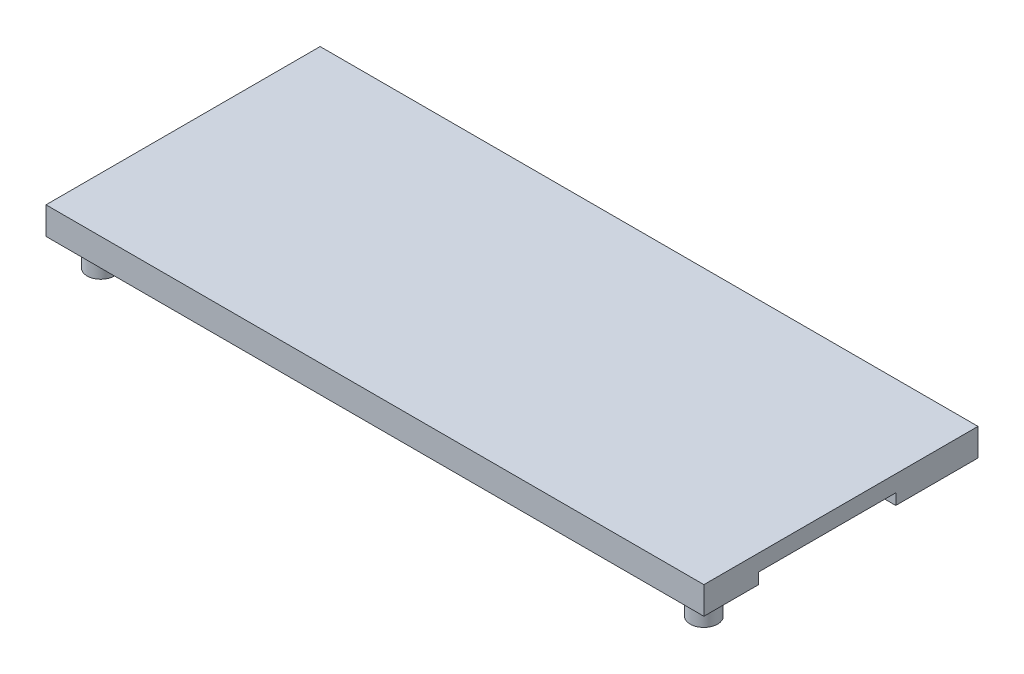
ISO-10303-21;
HEADER;
FILE_DESCRIPTION(('STEP AP214'),'2;1');
FILE_NAME('part.step','',(''),(''),'','','');
FILE_SCHEMA(('AUTOMOTIVE_DESIGN { 1 0 10303 214 1 1 1 1 }'));
ENDSEC;
DATA;
#1=APPLICATION_CONTEXT('core data for automotive mechanical design processes');
#2=APPLICATION_PROTOCOL_DEFINITION('international standard','automotive_design',2000,#1);
#3=PRODUCT_CONTEXT('',#1,'mechanical');
#4=PRODUCT('Part','Part','',(#3));
#5=PRODUCT_RELATED_PRODUCT_CATEGORY('part','',(#4));
#6=PRODUCT_DEFINITION_FORMATION('','',#4);
#7=PRODUCT_DEFINITION_CONTEXT('part definition',#1,'design');
#8=PRODUCT_DEFINITION('design','',#6,#7);
#9=PRODUCT_DEFINITION_SHAPE('','',#8);
#10=(LENGTH_UNIT() NAMED_UNIT(*) SI_UNIT(.MILLI.,.METRE.));
#11=(NAMED_UNIT(*) PLANE_ANGLE_UNIT() SI_UNIT($,.RADIAN.));
#12=(NAMED_UNIT(*) SI_UNIT($,.STERADIAN.) SOLID_ANGLE_UNIT());
#13=UNCERTAINTY_MEASURE_WITH_UNIT(LENGTH_MEASURE(1.E-05),#10,'distance_accuracy_value','');
#14=(GEOMETRIC_REPRESENTATION_CONTEXT(3) GLOBAL_UNCERTAINTY_ASSIGNED_CONTEXT((#13)) GLOBAL_UNIT_ASSIGNED_CONTEXT((#10,
#11,#12)) REPRESENTATION_CONTEXT('',''));
#15=CARTESIAN_POINT('',(0.,0.,0.));
#16=DIRECTION('',(0.,0.,1.));
#17=DIRECTION('',(1.,0.,0.));
#18=AXIS2_PLACEMENT_3D('',#15,#16,#17);
#19=CARTESIAN_POINT('',(380.766489354136,2.,-10.));
#20=DIRECTION('',(0.,0.,-1.));
#21=DIRECTION('',(-1.,0.,0.));
#22=AXIS2_PLACEMENT_3D('',#19,#20,#21);
#23=PLANE('',#22);
#24=DIRECTION('',(-0.850059990206795,-0.526685877017434,0.));
#25=VECTOR('',#24,1.);
#26=CARTESIAN_POINT('',(-46.1699249422818,2.,-10.));
#27=LINE('',#26,#25);
#28=CARTESIAN_POINT('',(-47.1379251019079,1.40023996082718,-10.));
#29=VERTEX_POINT('',#28);
#30=CARTESIAN_POINT('',(-49.3978831135569,0.,-10.));
#31=VERTEX_POINT('',#30);
#32=EDGE_CURVE('E211',#29,#31,#27,.T.);
#33=ORIENTED_EDGE('',*,*,#32,.F.);
#34=CARTESIAN_POINT('',(-45.0311815938382,-2.,-10.));
#35=DIRECTION('',(0.,0.,-1.));
#36=DIRECTION('',(-1.,0.,0.));
#37=AXIS2_PLACEMENT_3D('',#34,#35,#36);
#38=CIRCLE('',#37,4.);
#39=CARTESIAN_POINT('',(-45.0311815938382,2.,-10.));
#40=VERTEX_POINT('',#39);
#41=EDGE_CURVE('E425',#29,#40,#38,.T.);
#42=ORIENTED_EDGE('',*,*,#41,.T.);
#43=DIRECTION('',(-1.,0.,0.));
#44=VECTOR('',#43,1.);
#45=CARTESIAN_POINT('',(380.766489354136,2.,-10.));
#46=LINE('',#45,#44);
#47=CARTESIAN_POINT('',(-27.8534913925267,2.,-10.));
#48=VERTEX_POINT('',#47);
#49=EDGE_CURVE('E373',#48,#40,#46,.T.);
#50=ORIENTED_EDGE('',*,*,#49,.F.);
#51=DIRECTION('',(-0.00193419559193812,0.999998129441957,0.));
#52=VECTOR('',#51,1.);
#53=CARTESIAN_POINT('',(-27.8496229941068,0.,-10.));
#54=LINE('',#53,#52);
#55=CARTESIAN_POINT('',(-27.8496229941068,0.,-10.));
#56=VERTEX_POINT('',#55);
#57=EDGE_CURVE('E228',#56,#48,#54,.T.);
#58=ORIENTED_EDGE('',*,*,#57,.F.);
#59=DIRECTION('',(-1.,0.,0.));
#60=VECTOR('',#59,1.);
#61=CARTESIAN_POINT('',(380.766489354136,0.,-10.));
#62=LINE('',#61,#60);
#63=EDGE_CURVE('E226',#56,#31,#62,.T.);
#64=ORIENTED_EDGE('',*,*,#63,.T.);
#65=EDGE_LOOP('',(#33,#42,#50,#58,#64));
#66=FACE_BOUND('',#65,.T.);
#67=ADVANCED_FACE('F43',(#66),#23,.T.);
#68=CARTESIAN_POINT('',(380.766489354136,2.,-10.));
#69=DIRECTION('',(0.,-1.,0.));
#70=DIRECTION('',(0.,0.,-1.));
#71=AXIS2_PLACEMENT_3D('',#68,#69,#70);
#72=PLANE('',#71);
#73=ORIENTED_EDGE('',*,*,#49,.T.);
#74=DIRECTION('',(0.,0.,1.));
#75=VECTOR('',#74,1.);
#76=CARTESIAN_POINT('',(-45.0311815938382,2.,-10.));
#77=LINE('',#76,#75);
#78=CARTESIAN_POINT('',(-45.0311815938382,2.,-35.));
#79=VERTEX_POINT('',#78);
#80=EDGE_CURVE('E444',#40,#79,#77,.F.);
#81=ORIENTED_EDGE('',*,*,#80,.T.);
#82=DIRECTION('',(-1.,0.,0.));
#83=VECTOR('',#82,1.);
#84=CARTESIAN_POINT('',(380.766489354136,2.,-35.));
#85=LINE('',#84,#83);
#86=CARTESIAN_POINT('',(68.1463414634146,2.,-35.));
#87=VERTEX_POINT('',#86);
#88=EDGE_CURVE('E234',#87,#79,#85,.T.);
#89=ORIENTED_EDGE('',*,*,#88,.F.);
#90=DIRECTION('',(0.,0.,-1.));
#91=VECTOR('',#90,1.);
#92=CARTESIAN_POINT('',(68.1463414634146,2.,-10.));
#93=LINE('',#92,#91);
#94=CARTESIAN_POINT('',(68.1463414634146,2.,-10.));
#95=VERTEX_POINT('',#94);
#96=EDGE_CURVE('E360',#95,#87,#93,.T.);
#97=ORIENTED_EDGE('',*,*,#96,.F.);
#98=CARTESIAN_POINT('',(47.8052701751968,2.,-10.));
#99=VERTEX_POINT('',#98);
#100=EDGE_CURVE('E375',#95,#99,#46,.T.);
#101=ORIENTED_EDGE('',*,*,#100,.T.);
#102=DIRECTION('',(0.,0.,1.));
#103=VECTOR('',#102,1.);
#104=CARTESIAN_POINT('',(47.8052701751968,2.,-10.));
#105=LINE('',#104,#103);
#106=CARTESIAN_POINT('',(47.8052701751968,2.,-10.75));
#107=VERTEX_POINT('',#106);
#108=EDGE_CURVE('E440',#99,#107,#105,.F.);
#109=ORIENTED_EDGE('',*,*,#108,.T.);
#110=DIRECTION('',(1.,0.,0.));
#111=VECTOR('',#110,1.);
#112=CARTESIAN_POINT('',(46.1484159257044,2.,-10.75));
#113=LINE('',#112,#111);
#114=CARTESIAN_POINT('',(44.1484159257043,2.,-10.75));
#115=VERTEX_POINT('',#114);
#116=EDGE_CURVE('E338',#115,#107,#113,.T.);
#117=ORIENTED_EDGE('',*,*,#116,.F.);
#118=DIRECTION('',(0.,0.,1.));
#119=VECTOR('',#118,1.);
#120=CARTESIAN_POINT('',(44.1484159257044,2.,-10.75));
#121=LINE('',#120,#119);
#122=CARTESIAN_POINT('',(44.1484159257043,2.,-10.));
#123=VERTEX_POINT('',#122);
#124=EDGE_CURVE('E354',#115,#123,#121,.T.);
#125=ORIENTED_EDGE('',*,*,#124,.T.);
#126=CARTESIAN_POINT('',(23.8351869080494,2.,-10.));
#127=VERTEX_POINT('',#126);
#128=EDGE_CURVE('E380',#123,#127,#46,.T.);
#129=ORIENTED_EDGE('',*,*,#128,.T.);
#130=DIRECTION('',(0.,0.,1.));
#131=VECTOR('',#130,1.);
#132=CARTESIAN_POINT('',(23.8351869080494,2.,-10.));
#133=LINE('',#132,#131);
#134=CARTESIAN_POINT('',(23.8351869080494,2.,-13.8));
#135=VERTEX_POINT('',#134);
#136=EDGE_CURVE('E436',#127,#135,#133,.F.);
#137=ORIENTED_EDGE('',*,*,#136,.T.);
#138=DIRECTION('',(1.,0.,0.));
#139=VECTOR('',#138,1.);
#140=CARTESIAN_POINT('',(20.178332658557,2.,-13.8));
#141=LINE('',#140,#139);
#142=CARTESIAN_POINT('',(20.178332658557,2.,-13.8));
#143=VERTEX_POINT('',#142);
#144=EDGE_CURVE('E318',#143,#135,#141,.T.);
#145=ORIENTED_EDGE('',*,*,#144,.F.);
#146=DIRECTION('',(0.,0.,1.));
#147=VECTOR('',#146,1.);
#148=CARTESIAN_POINT('',(20.178332658557,2.,-13.8));
#149=LINE('',#148,#147);
#150=CARTESIAN_POINT('',(20.178332658557,2.,-10.));
#151=VERTEX_POINT('',#150);
#152=EDGE_CURVE('E321',#143,#151,#149,.T.);
#153=ORIENTED_EDGE('',*,*,#152,.T.);
#154=CARTESIAN_POINT('',(-0.196469998975601,2.,-10.));
#155=VERTEX_POINT('',#154);
#156=EDGE_CURVE('E500',#151,#155,#46,.T.);
#157=ORIENTED_EDGE('',*,*,#156,.T.);
#158=DIRECTION('',(0.,0.,1.));
#159=VECTOR('',#158,1.);
#160=CARTESIAN_POINT('',(-0.196469998975601,2.,-10.));
#161=LINE('',#160,#159);
#162=CARTESIAN_POINT('',(-0.196469998975591,2.,-15.95));
#163=VERTEX_POINT('',#162);
#164=EDGE_CURVE('E432',#155,#163,#161,.F.);
#165=ORIENTED_EDGE('',*,*,#164,.T.);
#166=DIRECTION('',(1.,0.,0.));
#167=VECTOR('',#166,1.);
#168=CARTESIAN_POINT('',(-3.85332424846797,2.,-15.95));
#169=LINE('',#168,#167);
#170=CARTESIAN_POINT('',(-3.85332424846802,2.,-15.95));
#171=VERTEX_POINT('',#170);
#172=EDGE_CURVE('E294',#171,#163,#169,.T.);
#173=ORIENTED_EDGE('',*,*,#172,.F.);
#174=DIRECTION('',(0.,0.,1.));
#175=VECTOR('',#174,1.);
#176=CARTESIAN_POINT('',(-3.85332424846797,2.,-15.95));
#177=LINE('',#176,#175);
#178=CARTESIAN_POINT('',(-3.85332424846802,2.,-10.));
#179=VERTEX_POINT('',#178);
#180=EDGE_CURVE('E297',#171,#179,#177,.T.);
#181=ORIENTED_EDGE('',*,*,#180,.T.);
#182=CARTESIAN_POINT('',(-24.1943684397684,2.,-10.));
#183=VERTEX_POINT('',#182);
#184=EDGE_CURVE('E507',#179,#183,#46,.T.);
#185=ORIENTED_EDGE('',*,*,#184,.T.);
#186=DIRECTION('',(0.,0.,1.));
#187=VECTOR('',#186,1.);
#188=CARTESIAN_POINT('',(-24.1943684397684,2.,-10.));
#189=LINE('',#188,#187);
#190=CARTESIAN_POINT('',(-24.1943684397684,2.,-17.1));
#191=VERTEX_POINT('',#190);
#192=EDGE_CURVE('E428',#183,#191,#189,.F.);
#193=ORIENTED_EDGE('',*,*,#192,.T.);
#194=DIRECTION('',(1.,0.,0.));
#195=VECTOR('',#194,1.);
#196=CARTESIAN_POINT('',(-27.8534913925267,2.,-17.1));
#197=LINE('',#196,#195);
#198=CARTESIAN_POINT('',(-27.8534913925267,2.,-17.1));
#199=VERTEX_POINT('',#198);
#200=EDGE_CURVE('E270',#199,#191,#197,.T.);
#201=ORIENTED_EDGE('',*,*,#200,.F.);
#202=DIRECTION('',(0.,0.,1.));
#203=VECTOR('',#202,1.);
#204=CARTESIAN_POINT('',(-27.8534913925267,2.,-17.1));
#205=LINE('',#204,#203);
#206=EDGE_CURVE('E273',#199,#48,#205,.T.);
#207=ORIENTED_EDGE('',*,*,#206,.T.);
#208=EDGE_LOOP('',(#73,#81,#89,#97,#101,#109,#117,#125,#129,#137,#145,#153,#157,#165,#173,#181,
#185,#193,#201,#207));
#209=FACE_BOUND('',#208,.T.);
#210=ADVANCED_FACE('F504',(#209),#72,.T.);
#211=CARTESIAN_POINT('',(380.766489354136,2.,-35.));
#212=DIRECTION('',(0.,0.,1.));
#213=DIRECTION('',(1.,0.,0.));
#214=AXIS2_PLACEMENT_3D('',#211,#212,#213);
#215=PLANE('',#214);
#216=ORIENTED_EDGE('',*,*,#88,.T.);
#217=CARTESIAN_POINT('',(-45.0311815938382,-2.,-35.));
#218=DIRECTION('',(0.,0.,1.));
#219=DIRECTION('',(1.,0.,0.));
#220=AXIS2_PLACEMENT_3D('',#217,#218,#219);
#221=CIRCLE('',#220,4.);
#222=CARTESIAN_POINT('',(-47.1379251019079,1.40023996082718,-35.));
#223=VERTEX_POINT('',#222);
#224=EDGE_CURVE('E447',#79,#223,#221,.T.);
#225=ORIENTED_EDGE('',*,*,#224,.T.);
#226=DIRECTION('',(-0.850059990206795,-0.526685877017434,0.));
#227=VECTOR('',#226,1.);
#228=CARTESIAN_POINT('',(-46.1699249422818,2.,-35.));
#229=LINE('',#228,#227);
#230=CARTESIAN_POINT('',(-49.3978831135569,0.,-35.));
#231=VERTEX_POINT('',#230);
#232=EDGE_CURVE('E222',#223,#231,#229,.T.);
#233=ORIENTED_EDGE('',*,*,#232,.T.);
#234=DIRECTION('',(-1.,0.,0.));
#235=VECTOR('',#234,1.);
#236=CARTESIAN_POINT('',(380.766489354136,0.,-35.));
#237=LINE('',#236,#235);
#238=CARTESIAN_POINT('',(68.1463414634146,0.,-35.));
#239=VERTEX_POINT('',#238);
#240=EDGE_CURVE('E240',#239,#231,#237,.T.);
#241=ORIENTED_EDGE('',*,*,#240,.F.);
#242=DIRECTION('',(0.,-1.,0.));
#243=VECTOR('',#242,1.);
#244=CARTESIAN_POINT('',(68.1463414634146,2.,-35.));
#245=LINE('',#244,#243);
#246=EDGE_CURVE('E363',#87,#239,#245,.T.);
#247=ORIENTED_EDGE('',*,*,#246,.F.);
#248=EDGE_LOOP('',(#216,#225,#233,#241,#247));
#249=FACE_BOUND('',#248,.T.);
#250=ADVANCED_FACE('F521',(#249),#215,.T.);
#251=DIRECTION('',(-0.706421945522024,-0.707790954226513,0.));
#252=VECTOR('',#251,1.);
#253=CARTESIAN_POINT('',(-25.8534913925267,2.,-10.));
#254=LINE('',#253,#252);
#255=CARTESIAN_POINT('',(-27.0255322566745,0.825687782088099,-10.));
#256=VERTEX_POINT('',#255);
#257=EDGE_CURVE('E259',#256,#56,#254,.T.);
#258=ORIENTED_EDGE('',*,*,#257,.F.);
#259=CARTESIAN_POINT('',(-24.1943684397684,-2.,-10.));
#260=DIRECTION('',(0.,0.,-1.));
#261=DIRECTION('',(-1.,0.,0.));
#262=AXIS2_PLACEMENT_3D('',#259,#260,#261);
#263=CIRCLE('',#262,4.);
#264=EDGE_CURVE('E65',#256,#183,#263,.T.);
#265=ORIENTED_EDGE('',*,*,#264,.T.);
#266=ORIENTED_EDGE('',*,*,#184,.F.);
#267=DIRECTION('',(0.,1.,0.));
#268=VECTOR('',#267,1.);
#269=CARTESIAN_POINT('',(-3.85332424846797,0.,-10.));
#270=LINE('',#269,#268);
#271=CARTESIAN_POINT('',(-3.85332424846796,0.,-10.));
#272=VERTEX_POINT('',#271);
#273=EDGE_CURVE('E290',#272,#179,#270,.T.);
#274=ORIENTED_EDGE('',*,*,#273,.F.);
#275=EDGE_CURVE('E233',#272,#56,#62,.T.);
#276=ORIENTED_EDGE('',*,*,#275,.T.);
#277=EDGE_LOOP('',(#258,#265,#266,#274,#276));
#278=FACE_BOUND('',#277,.T.);
#279=ADVANCED_FACE('F568',(#278),#23,.T.);
#280=DIRECTION('',(-0.707106781186547,-0.707106781186548,0.));
#281=VECTOR('',#280,1.);
#282=CARTESIAN_POINT('',(-1.85332424846797,2.,-10.));
#283=LINE('',#282,#281);
#284=CARTESIAN_POINT('',(-3.02489712372178,0.828427124746191,-10.));
#285=VERTEX_POINT('',#284);
#286=EDGE_CURVE('E285',#285,#272,#283,.T.);
#287=ORIENTED_EDGE('',*,*,#286,.F.);
#288=CARTESIAN_POINT('',(-0.196469998975592,-2.,-10.));
#289=DIRECTION('',(0.,0.,-1.));
#290=DIRECTION('',(-1.,0.,0.));
#291=AXIS2_PLACEMENT_3D('',#288,#289,#290);
#292=CIRCLE('',#291,4.);
#293=EDGE_CURVE('E468',#285,#155,#292,.T.);
#294=ORIENTED_EDGE('',*,*,#293,.T.);
#295=ORIENTED_EDGE('',*,*,#156,.F.);
#296=DIRECTION('',(0.,1.,0.));
#297=VECTOR('',#296,1.);
#298=CARTESIAN_POINT('',(20.178332658557,0.,-10.));
#299=LINE('',#298,#297);
#300=CARTESIAN_POINT('',(20.178332658557,0.,-10.));
#301=VERTEX_POINT('',#300);
#302=EDGE_CURVE('E314',#301,#151,#299,.T.);
#303=ORIENTED_EDGE('',*,*,#302,.F.);
#304=EDGE_CURVE('E940',#301,#272,#62,.T.);
#305=ORIENTED_EDGE('',*,*,#304,.T.);
#306=EDGE_LOOP('',(#287,#294,#295,#303,#305));
#307=FACE_BOUND('',#306,.T.);
#308=ADVANCED_FACE('F498',(#307),#23,.T.);
#309=DIRECTION('',(-0.707106781186548,-0.707106781186547,0.));
#310=VECTOR('',#309,1.);
#311=CARTESIAN_POINT('',(22.178332658557,2.,-10.));
#312=LINE('',#311,#310);
#313=CARTESIAN_POINT('',(21.0067597833032,0.828427124746192,-10.));
#314=VERTEX_POINT('',#313);
#315=EDGE_CURVE('E309',#314,#301,#312,.T.);
#316=ORIENTED_EDGE('',*,*,#315,.F.);
#317=CARTESIAN_POINT('',(23.8351869080494,-2.,-10.));
#318=DIRECTION('',(0.,0.,-1.));
#319=DIRECTION('',(-1.,0.,0.));
#320=AXIS2_PLACEMENT_3D('',#317,#318,#319);
#321=CIRCLE('',#320,4.);
#322=EDGE_CURVE('E461',#314,#127,#321,.T.);
#323=ORIENTED_EDGE('',*,*,#322,.T.);
#324=ORIENTED_EDGE('',*,*,#128,.F.);
#325=DIRECTION('',(0.,1.,0.));
#326=VECTOR('',#325,1.);
#327=CARTESIAN_POINT('',(44.1484159257044,2.,-10.));
#328=LINE('',#327,#326);
#329=CARTESIAN_POINT('',(44.1484159257044,0.,-10.));
#330=VERTEX_POINT('',#329);
#331=EDGE_CURVE('E333',#330,#123,#328,.T.);
#332=ORIENTED_EDGE('',*,*,#331,.F.);
#333=EDGE_CURVE('E374',#330,#301,#62,.T.);
#334=ORIENTED_EDGE('',*,*,#333,.T.);
#335=EDGE_LOOP('',(#316,#323,#324,#332,#334));
#336=FACE_BOUND('',#335,.T.);
#337=ADVANCED_FACE('F549',(#336),#23,.T.);
#338=DIRECTION('',(-0.707106781186547,-0.707106781186547,0.));
#339=VECTOR('',#338,1.);
#340=CARTESIAN_POINT('',(44.1484159257044,0.,-10.));
#341=LINE('',#340,#339);
#342=CARTESIAN_POINT('',(44.9768430504506,0.828427124746193,-10.));
#343=VERTEX_POINT('',#342);
#344=EDGE_CURVE('E339',#343,#330,#341,.T.);
#345=ORIENTED_EDGE('',*,*,#344,.F.);
#346=CARTESIAN_POINT('',(47.8052701751968,-2.,-10.));
#347=DIRECTION('',(0.,0.,-1.));
#348=DIRECTION('',(-1.,0.,0.));
#349=AXIS2_PLACEMENT_3D('',#346,#347,#348);
#350=CIRCLE('',#349,4.);
#351=EDGE_CURVE('E454',#343,#99,#350,.T.);
#352=ORIENTED_EDGE('',*,*,#351,.T.);
#353=ORIENTED_EDGE('',*,*,#100,.F.);
#354=DIRECTION('',(0.,1.,0.));
#355=VECTOR('',#354,1.);
#356=CARTESIAN_POINT('',(68.1463414634146,2.,-10.));
#357=LINE('',#356,#355);
#358=CARTESIAN_POINT('',(68.1463414634146,0.,-10.));
#359=VERTEX_POINT('',#358);
#360=EDGE_CURVE('E357',#359,#95,#357,.T.);
#361=ORIENTED_EDGE('',*,*,#360,.F.);
#362=EDGE_CURVE('E236',#359,#330,#62,.T.);
#363=ORIENTED_EDGE('',*,*,#362,.T.);
#364=EDGE_LOOP('',(#345,#352,#353,#361,#363));
#365=FACE_BOUND('',#364,.T.);
#366=ADVANCED_FACE('F530',(#365),#23,.T.);
#367=CARTESIAN_POINT('',(-51.8536585365854,5.,0.));
#368=DIRECTION('',(1.,0.,0.));
#369=DIRECTION('',(0.,0.,-1.));
#370=AXIS2_PLACEMENT_3D('',#367,#368,#369);
#371=PLANE('',#370);
#372=DIRECTION('',(0.,0.,1.));
#373=VECTOR('',#372,1.);
#374=CARTESIAN_POINT('',(-51.8536585365854,0.,0.));
#375=LINE('',#374,#373);
#376=CARTESIAN_POINT('',(-51.8536585365854,0.,-50.));
#377=VERTEX_POINT('',#376);
#378=CARTESIAN_POINT('',(-51.8536585365854,0.,0.));
#379=VERTEX_POINT('',#378);
#380=EDGE_CURVE('E379',#377,#379,#375,.T.);
#381=ORIENTED_EDGE('',*,*,#380,.T.);
#382=DIRECTION('',(0.,-1.,0.));
#383=VECTOR('',#382,1.);
#384=CARTESIAN_POINT('',(-51.8536585365854,5.,0.));
#385=LINE('',#384,#383);
#386=CARTESIAN_POINT('',(-51.8536585365854,5.,0.));
#387=VERTEX_POINT('',#386);
#388=EDGE_CURVE('E419',#387,#379,#385,.T.);
#389=ORIENTED_EDGE('',*,*,#388,.F.);
#390=DIRECTION('',(0.,0.,1.));
#391=VECTOR('',#390,1.);
#392=CARTESIAN_POINT('',(-51.8536585365854,5.,0.));
#393=LINE('',#392,#391);
#394=CARTESIAN_POINT('',(-51.8536585365854,5.,-50.));
#395=VERTEX_POINT('',#394);
#396=EDGE_CURVE('E381',#395,#387,#393,.T.);
#397=ORIENTED_EDGE('',*,*,#396,.F.);
#398=DIRECTION('',(0.,-1.,0.));
#399=VECTOR('',#398,1.);
#400=CARTESIAN_POINT('',(-51.8536585365854,5.,-50.));
#401=LINE('',#400,#399);
#402=EDGE_CURVE('E395',#395,#377,#401,.T.);
#403=ORIENTED_EDGE('',*,*,#402,.T.);
#404=EDGE_LOOP('',(#381,#389,#397,#403));
#405=FACE_BOUND('',#404,.T.);
#406=ADVANCED_FACE('F582',(#405),#371,.F.);
#407=CARTESIAN_POINT('',(-51.8536585365854,5.,0.));
#408=DIRECTION('',(0.,0.,-1.));
#409=DIRECTION('',(-1.,0.,0.));
#410=AXIS2_PLACEMENT_3D('',#407,#408,#409);
#411=PLANE('',#410);
#412=DIRECTION('',(1.,0.,0.));
#413=VECTOR('',#412,1.);
#414=CARTESIAN_POINT('',(-51.8536585365854,0.,0.));
#415=LINE('',#414,#413);
#416=CARTESIAN_POINT('',(68.1463414634146,0.,0.));
#417=VERTEX_POINT('',#416);
#418=EDGE_CURVE('E398',#379,#417,#415,.T.);
#419=ORIENTED_EDGE('',*,*,#418,.T.);
#420=DIRECTION('',(0.,-1.,0.));
#421=VECTOR('',#420,1.);
#422=CARTESIAN_POINT('',(68.1463414634146,5.,0.));
#423=LINE('',#422,#421);
#424=CARTESIAN_POINT('',(68.1463414634146,5.,0.));
#425=VERTEX_POINT('',#424);
#426=EDGE_CURVE('E415',#425,#417,#423,.T.);
#427=ORIENTED_EDGE('',*,*,#426,.F.);
#428=DIRECTION('',(1.,0.,0.));
#429=VECTOR('',#428,1.);
#430=CARTESIAN_POINT('',(-51.8536585365854,5.,0.));
#431=LINE('',#430,#429);
#432=EDGE_CURVE('E385',#387,#425,#431,.T.);
#433=ORIENTED_EDGE('',*,*,#432,.F.);
#434=ORIENTED_EDGE('',*,*,#388,.T.);
#435=EDGE_LOOP('',(#419,#427,#433,#434));
#436=FACE_BOUND('',#435,.T.);
#437=ADVANCED_FACE('F744',(#436),#411,.F.);
#438=CARTESIAN_POINT('',(68.1463414634146,5.,0.));
#439=DIRECTION('',(-1.,0.,0.));
#440=DIRECTION('',(0.,0.,1.));
#441=AXIS2_PLACEMENT_3D('',#438,#439,#440);
#442=PLANE('',#441);
#443=DIRECTION('',(0.,0.,-1.));
#444=VECTOR('',#443,1.);
#445=CARTESIAN_POINT('',(68.1463414634146,0.,0.));
#446=LINE('',#445,#444);
#447=EDGE_CURVE('E402',#417,#359,#446,.T.);
#448=ORIENTED_EDGE('',*,*,#447,.T.);
#449=ORIENTED_EDGE('',*,*,#360,.T.);
#450=ORIENTED_EDGE('',*,*,#96,.T.);
#451=ORIENTED_EDGE('',*,*,#246,.T.);
#452=CARTESIAN_POINT('',(68.1463414634146,0.,-50.));
#453=VERTEX_POINT('',#452);
#454=EDGE_CURVE('E401',#239,#453,#446,.T.);
#455=ORIENTED_EDGE('',*,*,#454,.T.);
#456=DIRECTION('',(0.,-1.,0.));
#457=VECTOR('',#456,1.);
#458=CARTESIAN_POINT('',(68.1463414634146,5.,-50.));
#459=LINE('',#458,#457);
#460=CARTESIAN_POINT('',(68.1463414634146,5.,-50.));
#461=VERTEX_POINT('',#460);
#462=EDGE_CURVE('E411',#461,#453,#459,.T.);
#463=ORIENTED_EDGE('',*,*,#462,.F.);
#464=DIRECTION('',(0.,0.,-1.));
#465=VECTOR('',#464,1.);
#466=CARTESIAN_POINT('',(68.1463414634146,5.,0.));
#467=LINE('',#466,#465);
#468=EDGE_CURVE('E389',#425,#461,#467,.T.);
#469=ORIENTED_EDGE('',*,*,#468,.F.);
#470=ORIENTED_EDGE('',*,*,#426,.T.);
#471=EDGE_LOOP('',(#448,#449,#450,#451,#455,#463,#469,#470));
#472=FACE_BOUND('',#471,.T.);
#473=ADVANCED_FACE('F748',(#472),#442,.F.);
#474=CARTESIAN_POINT('',(-51.8536585365854,5.,-50.));
#475=DIRECTION('',(0.,0.,1.));
#476=DIRECTION('',(1.,0.,0.));
#477=AXIS2_PLACEMENT_3D('',#474,#475,#476);
#478=PLANE('',#477);
#479=DIRECTION('',(-1.,0.,0.));
#480=VECTOR('',#479,1.);
#481=CARTESIAN_POINT('',(-51.8536585365854,0.,-50.));
#482=LINE('',#481,#480);
#483=EDGE_CURVE('E386',#453,#377,#482,.T.);
#484=ORIENTED_EDGE('',*,*,#483,.T.);
#485=ORIENTED_EDGE('',*,*,#402,.F.);
#486=DIRECTION('',(-1.,0.,0.));
#487=VECTOR('',#486,1.);
#488=CARTESIAN_POINT('',(-51.8536585365854,5.,-50.));
#489=LINE('',#488,#487);
#490=EDGE_CURVE('E392',#461,#395,#489,.T.);
#491=ORIENTED_EDGE('',*,*,#490,.F.);
#492=ORIENTED_EDGE('',*,*,#462,.T.);
#493=EDGE_LOOP('',(#484,#485,#491,#492));
#494=FACE_BOUND('',#493,.T.);
#495=ADVANCED_FACE('F757',(#494),#478,.F.);
#496=CARTESIAN_POINT('',(0.,5.,0.));
#497=DIRECTION('',(0.,-1.,0.));
#498=DIRECTION('',(0.,0.,-1.));
#499=AXIS2_PLACEMENT_3D('',#496,#497,#498);
#500=PLANE('',#499);
#501=ORIENTED_EDGE('',*,*,#396,.T.);
#502=ORIENTED_EDGE('',*,*,#432,.T.);
#503=ORIENTED_EDGE('',*,*,#468,.T.);
#504=ORIENTED_EDGE('',*,*,#490,.T.);
#505=EDGE_LOOP('',(#501,#502,#503,#504));
#506=FACE_BOUND('',#505,.T.);
#507=ADVANCED_FACE('F562',(#506),#500,.F.);
#508=CARTESIAN_POINT('',(0.,0.,0.));
#509=DIRECTION('',(0.,-1.,0.));
#510=DIRECTION('',(0.,0.,-1.));
#511=AXIS2_PLACEMENT_3D('',#508,#509,#510);
#512=PLANE('',#511);
#513=CARTESIAN_POINT('',(63.1463414634146,0.,-5.));
#514=DIRECTION('',(0.,-1.,0.));
#515=DIRECTION('',(0.,0.,-1.));
#516=AXIS2_PLACEMENT_3D('',#513,#514,#515);
#517=CIRCLE('',#516,2.50000000000001);
#518=CARTESIAN_POINT('',(63.1463414634146,0.,-7.50000000000001));
#519=VERTEX_POINT('',#518);
#520=EDGE_CURVE('E247',#519,#519,#517,.T.);
#521=ORIENTED_EDGE('',*,*,#520,.F.);
#522=EDGE_LOOP('',(#521));
#523=FACE_BOUND('',#522,.T.);
#524=CARTESIAN_POINT('',(-46.8536585365854,0.,-5.));
#525=DIRECTION('',(0.,-1.,0.));
#526=DIRECTION('',(0.,0.,-1.));
#527=AXIS2_PLACEMENT_3D('',#524,#525,#526);
#528=CIRCLE('',#527,2.5);
#529=CARTESIAN_POINT('',(-46.8536585365854,0.,-7.5));
#530=VERTEX_POINT('',#529);
#531=EDGE_CURVE('E253',#530,#530,#528,.T.);
#532=ORIENTED_EDGE('',*,*,#531,.F.);
#533=EDGE_LOOP('',(#532));
#534=FACE_BOUND('',#533,.T.);
#535=ORIENTED_EDGE('',*,*,#362,.F.);
#536=ORIENTED_EDGE('',*,*,#447,.F.);
#537=ORIENTED_EDGE('',*,*,#418,.F.);
#538=ORIENTED_EDGE('',*,*,#380,.F.);
#539=ORIENTED_EDGE('',*,*,#483,.F.);
#540=ORIENTED_EDGE('',*,*,#454,.F.);
#541=ORIENTED_EDGE('',*,*,#240,.T.);
#542=DIRECTION('',(0.,0.,1.));
#543=VECTOR('',#542,1.);
#544=CARTESIAN_POINT('',(-49.3978831135569,0.,-35.));
#545=LINE('',#544,#543);
#546=EDGE_CURVE('E216',#231,#31,#545,.T.);
#547=ORIENTED_EDGE('',*,*,#546,.T.);
#548=ORIENTED_EDGE('',*,*,#63,.F.);
#549=ORIENTED_EDGE('',*,*,#275,.F.);
#550=ORIENTED_EDGE('',*,*,#304,.F.);
#551=ORIENTED_EDGE('',*,*,#333,.F.);
#552=EDGE_LOOP('',(#535,#536,#537,#538,#539,#540,#541,#547,#548,#549,#550,#551));
#553=FACE_BOUND('',#552,.T.);
#554=ADVANCED_FACE('F237',(#523,#534,#553),#512,.T.);
#555=CARTESIAN_POINT('',(44.1484159257044,2.,-10.75));
#556=DIRECTION('',(1.,0.,0.));
#557=DIRECTION('',(0.,0.,-1.));
#558=AXIS2_PLACEMENT_3D('',#555,#556,#557);
#559=PLANE('',#558);
#560=ORIENTED_EDGE('',*,*,#331,.T.);
#561=ORIENTED_EDGE('',*,*,#124,.F.);
#562=DIRECTION('',(0.,1.,0.));
#563=VECTOR('',#562,1.);
#564=CARTESIAN_POINT('',(44.1484159257044,2.,-10.75));
#565=LINE('',#564,#563);
#566=CARTESIAN_POINT('',(44.1484159257044,0.,-10.75));
#567=VERTEX_POINT('',#566);
#568=EDGE_CURVE('E334',#567,#115,#565,.T.);
#569=ORIENTED_EDGE('',*,*,#568,.F.);
#570=DIRECTION('',(0.,0.,1.));
#571=VECTOR('',#570,1.);
#572=CARTESIAN_POINT('',(44.1484159257044,0.,-10.75));
#573=LINE('',#572,#571);
#574=EDGE_CURVE('E345',#567,#330,#573,.T.);
#575=ORIENTED_EDGE('',*,*,#574,.T.);
#576=EDGE_LOOP('',(#560,#561,#569,#575));
#577=FACE_BOUND('',#576,.T.);
#578=ADVANCED_FACE('F552',(#577),#559,.F.);
#579=CARTESIAN_POINT('',(44.1484159257044,0.,-10.75));
#580=DIRECTION('',(-0.707106781186548,0.707106781186548,0.));
#581=DIRECTION('',(-0.707106781186548,-0.707106781186548,0.));
#582=AXIS2_PLACEMENT_3D('',#579,#580,#581);
#583=PLANE('',#582);
#584=DIRECTION('',(-0.707106781186547,-0.707106781186547,0.));
#585=VECTOR('',#584,1.);
#586=CARTESIAN_POINT('',(44.1484159257044,0.,-10.75));
#587=LINE('',#586,#585);
#588=CARTESIAN_POINT('',(44.9768430504506,0.828427124746193,-10.75));
#589=VERTEX_POINT('',#588);
#590=EDGE_CURVE('E342',#589,#567,#587,.T.);
#591=ORIENTED_EDGE('',*,*,#590,.F.);
#592=DIRECTION('',(0.,0.,1.));
#593=VECTOR('',#592,1.);
#594=CARTESIAN_POINT('',(44.9768430504506,0.828427124746193,-10.75));
#595=LINE('',#594,#593);
#596=EDGE_CURVE('E450',#589,#343,#595,.T.);
#597=ORIENTED_EDGE('',*,*,#596,.T.);
#598=ORIENTED_EDGE('',*,*,#344,.T.);
#599=ORIENTED_EDGE('',*,*,#574,.F.);
#600=EDGE_LOOP('',(#591,#597,#598,#599));
#601=FACE_BOUND('',#600,.T.);
#602=ADVANCED_FACE('F537',(#601),#583,.F.);
#603=CARTESIAN_POINT('',(0.,0.,-10.75));
#604=DIRECTION('',(0.,0.,-1.));
#605=DIRECTION('',(-1.,0.,0.));
#606=AXIS2_PLACEMENT_3D('',#603,#604,#605);
#607=PLANE('',#606);
#608=ORIENTED_EDGE('',*,*,#568,.T.);
#609=ORIENTED_EDGE('',*,*,#116,.T.);
#610=CARTESIAN_POINT('',(47.8052701751968,-2.,-10.75));
#611=DIRECTION('',(0.,0.,-1.));
#612=DIRECTION('',(-1.,0.,0.));
#613=AXIS2_PLACEMENT_3D('',#610,#611,#612);
#614=CIRCLE('',#613,4.);
#615=EDGE_CURVE('E476',#107,#589,#614,.F.);
#616=ORIENTED_EDGE('',*,*,#615,.T.);
#617=ORIENTED_EDGE('',*,*,#590,.T.);
#618=EDGE_LOOP('',(#608,#609,#616,#617));
#619=FACE_BOUND('',#618,.T.);
#620=ADVANCED_FACE('F542',(#619),#607,.T.);
#621=CARTESIAN_POINT('',(22.178332658557,2.,-13.8));
#622=DIRECTION('',(-0.707106781186547,0.707106781186548,0.));
#623=DIRECTION('',(-0.707106781186548,-0.707106781186547,0.));
#624=AXIS2_PLACEMENT_3D('',#621,#622,#623);
#625=PLANE('',#624);
#626=DIRECTION('',(-0.707106781186548,-0.707106781186547,0.));
#627=VECTOR('',#626,1.);
#628=CARTESIAN_POINT('',(22.178332658557,2.,-13.8));
#629=LINE('',#628,#627);
#630=CARTESIAN_POINT('',(21.0067597833032,0.828427124746192,-13.8));
#631=VERTEX_POINT('',#630);
#632=CARTESIAN_POINT('',(20.178332658557,0.,-13.8));
#633=VERTEX_POINT('',#632);
#634=EDGE_CURVE('E310',#631,#633,#629,.T.);
#635=ORIENTED_EDGE('',*,*,#634,.F.);
#636=DIRECTION('',(0.,0.,1.));
#637=VECTOR('',#636,1.);
#638=CARTESIAN_POINT('',(21.0067597833032,0.828427124746192,-13.8));
#639=LINE('',#638,#637);
#640=EDGE_CURVE('E457',#631,#314,#639,.T.);
#641=ORIENTED_EDGE('',*,*,#640,.T.);
#642=ORIENTED_EDGE('',*,*,#315,.T.);
#643=DIRECTION('',(0.,0.,1.));
#644=VECTOR('',#643,1.);
#645=CARTESIAN_POINT('',(20.178332658557,0.,-13.8));
#646=LINE('',#645,#644);
#647=EDGE_CURVE('E329',#633,#301,#646,.T.);
#648=ORIENTED_EDGE('',*,*,#647,.F.);
#649=EDGE_LOOP('',(#635,#641,#642,#648));
#650=FACE_BOUND('',#649,.T.);
#651=ADVANCED_FACE('F717',(#650),#625,.F.);
#652=CARTESIAN_POINT('',(20.178332658557,0.,-13.8));
#653=DIRECTION('',(1.,0.,0.));
#654=DIRECTION('',(0.,1.,0.));
#655=AXIS2_PLACEMENT_3D('',#652,#653,#654);
#656=PLANE('',#655);
#657=ORIENTED_EDGE('',*,*,#302,.T.);
#658=ORIENTED_EDGE('',*,*,#152,.F.);
#659=DIRECTION('',(0.,1.,0.));
#660=VECTOR('',#659,1.);
#661=CARTESIAN_POINT('',(20.178332658557,0.,-13.8));
#662=LINE('',#661,#660);
#663=EDGE_CURVE('E313',#633,#143,#662,.T.);
#664=ORIENTED_EDGE('',*,*,#663,.F.);
#665=ORIENTED_EDGE('',*,*,#647,.T.);
#666=EDGE_LOOP('',(#657,#658,#664,#665));
#667=FACE_BOUND('',#666,.T.);
#668=ADVANCED_FACE('F711',(#667),#656,.F.);
#669=CARTESIAN_POINT('',(0.,0.,-13.8));
#670=DIRECTION('',(0.,0.,-1.));
#671=DIRECTION('',(-1.,0.,0.));
#672=AXIS2_PLACEMENT_3D('',#669,#670,#671);
#673=PLANE('',#672);
#674=ORIENTED_EDGE('',*,*,#144,.T.);
#675=CARTESIAN_POINT('',(23.8351869080494,-2.,-13.8));
#676=DIRECTION('',(0.,0.,-1.));
#677=DIRECTION('',(-1.,0.,0.));
#678=AXIS2_PLACEMENT_3D('',#675,#676,#677);
#679=CIRCLE('',#678,4.);
#680=EDGE_CURVE('E479',#135,#631,#679,.F.);
#681=ORIENTED_EDGE('',*,*,#680,.T.);
#682=ORIENTED_EDGE('',*,*,#634,.T.);
#683=ORIENTED_EDGE('',*,*,#663,.T.);
#684=EDGE_LOOP('',(#674,#681,#682,#683));
#685=FACE_BOUND('',#684,.T.);
#686=ADVANCED_FACE('F704',(#685),#673,.T.);
#687=CARTESIAN_POINT('',(-1.85332424846797,2.,-15.95));
#688=DIRECTION('',(-0.707106781186548,0.707106781186547,0.));
#689=DIRECTION('',(-0.707106781186547,-0.707106781186548,0.));
#690=AXIS2_PLACEMENT_3D('',#687,#688,#689);
#691=PLANE('',#690);
#692=DIRECTION('',(-0.707106781186547,-0.707106781186548,0.));
#693=VECTOR('',#692,1.);
#694=CARTESIAN_POINT('',(-1.85332424846797,2.,-15.95));
#695=LINE('',#694,#693);
#696=CARTESIAN_POINT('',(-3.02489712372178,0.828427124746191,-15.95));
#697=VERTEX_POINT('',#696);
#698=CARTESIAN_POINT('',(-3.85332424846797,0.,-15.95));
#699=VERTEX_POINT('',#698);
#700=EDGE_CURVE('E286',#697,#699,#695,.T.);
#701=ORIENTED_EDGE('',*,*,#700,.F.);
#702=DIRECTION('',(0.,0.,1.));
#703=VECTOR('',#702,1.);
#704=CARTESIAN_POINT('',(-3.02489712372178,0.828427124746191,-15.95));
#705=LINE('',#704,#703);
#706=EDGE_CURVE('E464',#697,#285,#705,.T.);
#707=ORIENTED_EDGE('',*,*,#706,.T.);
#708=ORIENTED_EDGE('',*,*,#286,.T.);
#709=DIRECTION('',(0.,0.,1.));
#710=VECTOR('',#709,1.);
#711=CARTESIAN_POINT('',(-3.85332424846797,0.,-15.95));
#712=LINE('',#711,#710);
#713=EDGE_CURVE('E305',#699,#272,#712,.T.);
#714=ORIENTED_EDGE('',*,*,#713,.F.);
#715=EDGE_LOOP('',(#701,#707,#708,#714));
#716=FACE_BOUND('',#715,.T.);
#717=ADVANCED_FACE('F492',(#716),#691,.F.);
#718=CARTESIAN_POINT('',(-3.85332424846797,0.,-15.95));
#719=DIRECTION('',(1.,0.,0.));
#720=DIRECTION('',(0.,0.,-1.));
#721=AXIS2_PLACEMENT_3D('',#718,#719,#720);
#722=PLANE('',#721);
#723=ORIENTED_EDGE('',*,*,#273,.T.);
#724=ORIENTED_EDGE('',*,*,#180,.F.);
#725=DIRECTION('',(0.,1.,0.));
#726=VECTOR('',#725,1.);
#727=CARTESIAN_POINT('',(-3.85332424846797,0.,-15.95));
#728=LINE('',#727,#726);
#729=EDGE_CURVE('E289',#699,#171,#728,.T.);
#730=ORIENTED_EDGE('',*,*,#729,.F.);
#731=ORIENTED_EDGE('',*,*,#713,.T.);
#732=EDGE_LOOP('',(#723,#724,#730,#731));
#733=FACE_BOUND('',#732,.T.);
#734=ADVANCED_FACE('F696',(#733),#722,.F.);
#735=CARTESIAN_POINT('',(0.,0.,-15.95));
#736=DIRECTION('',(0.,0.,-1.));
#737=DIRECTION('',(-1.,0.,0.));
#738=AXIS2_PLACEMENT_3D('',#735,#736,#737);
#739=PLANE('',#738);
#740=ORIENTED_EDGE('',*,*,#172,.T.);
#741=CARTESIAN_POINT('',(-0.196469998975591,-2.,-15.95));
#742=DIRECTION('',(0.,0.,-1.));
#743=DIRECTION('',(-1.,0.,0.));
#744=AXIS2_PLACEMENT_3D('',#741,#742,#743);
#745=CIRCLE('',#744,4.);
#746=EDGE_CURVE('E52',#163,#697,#745,.F.);
#747=ORIENTED_EDGE('',*,*,#746,.T.);
#748=ORIENTED_EDGE('',*,*,#700,.T.);
#749=ORIENTED_EDGE('',*,*,#729,.T.);
#750=EDGE_LOOP('',(#740,#747,#748,#749));
#751=FACE_BOUND('',#750,.T.);
#752=ADVANCED_FACE('F485',(#751),#739,.T.);
#753=CARTESIAN_POINT('',(-25.8534913925267,2.,-17.1));
#754=DIRECTION('',(-0.707790954226513,0.706421945522024,0.));
#755=DIRECTION('',(-0.706421945522024,-0.707790954226513,0.));
#756=AXIS2_PLACEMENT_3D('',#753,#754,#755);
#757=PLANE('',#756);
#758=DIRECTION('',(-0.706421945522024,-0.707790954226513,0.));
#759=VECTOR('',#758,1.);
#760=CARTESIAN_POINT('',(-25.8534913925267,2.,-17.1));
#761=LINE('',#760,#759);
#762=CARTESIAN_POINT('',(-27.0255322566745,0.825687782088099,-17.1));
#763=VERTEX_POINT('',#762);
#764=CARTESIAN_POINT('',(-27.8496229941068,0.,-17.1));
#765=VERTEX_POINT('',#764);
#766=EDGE_CURVE('E263',#763,#765,#761,.T.);
#767=ORIENTED_EDGE('',*,*,#766,.F.);
#768=DIRECTION('',(0.,0.,1.));
#769=VECTOR('',#768,1.);
#770=CARTESIAN_POINT('',(-27.0255322566745,0.8256877820881,-17.1));
#771=LINE('',#770,#769);
#772=EDGE_CURVE('E471',#763,#256,#771,.T.);
#773=ORIENTED_EDGE('',*,*,#772,.T.);
#774=ORIENTED_EDGE('',*,*,#257,.T.);
#775=DIRECTION('',(0.,0.,1.));
#776=VECTOR('',#775,1.);
#777=CARTESIAN_POINT('',(-27.8496229941068,0.,-17.1));
#778=LINE('',#777,#776);
#779=EDGE_CURVE('E281',#765,#56,#778,.T.);
#780=ORIENTED_EDGE('',*,*,#779,.F.);
#781=EDGE_LOOP('',(#767,#773,#774,#780));
#782=FACE_BOUND('',#781,.T.);
#783=ADVANCED_FACE('F685',(#782),#757,.F.);
#784=CARTESIAN_POINT('',(-27.8496229941068,0.,-17.1));
#785=DIRECTION('',(0.999998129441957,0.00193419559193812,0.));
#786=DIRECTION('',(-0.00193419559193812,0.999998129441957,0.));
#787=AXIS2_PLACEMENT_3D('',#784,#785,#786);
#788=PLANE('',#787);
#789=ORIENTED_EDGE('',*,*,#57,.T.);
#790=ORIENTED_EDGE('',*,*,#206,.F.);
#791=DIRECTION('',(-0.00193419559193812,0.999998129441957,0.));
#792=VECTOR('',#791,1.);
#793=CARTESIAN_POINT('',(-27.8496229941068,0.,-17.1));
#794=LINE('',#793,#792);
#795=EDGE_CURVE('E266',#765,#199,#794,.T.);
#796=ORIENTED_EDGE('',*,*,#795,.F.);
#797=ORIENTED_EDGE('',*,*,#779,.T.);
#798=EDGE_LOOP('',(#789,#790,#796,#797));
#799=FACE_BOUND('',#798,.T.);
#800=ADVANCED_FACE('F679',(#799),#788,.F.);
#801=CARTESIAN_POINT('',(0.,0.,-17.1));
#802=DIRECTION('',(0.,0.,1.));
#803=DIRECTION('',(1.,0.,0.));
#804=AXIS2_PLACEMENT_3D('',#801,#802,#803);
#805=PLANE('',#804);
#806=ORIENTED_EDGE('',*,*,#200,.T.);
#807=CARTESIAN_POINT('',(-24.1943684397684,-2.,-17.1));
#808=DIRECTION('',(0.,0.,1.));
#809=DIRECTION('',(1.,0.,0.));
#810=AXIS2_PLACEMENT_3D('',#807,#808,#809);
#811=CIRCLE('',#810,4.);
#812=EDGE_CURVE('E11',#191,#763,#811,.T.);
#813=ORIENTED_EDGE('',*,*,#812,.T.);
#814=ORIENTED_EDGE('',*,*,#766,.T.);
#815=ORIENTED_EDGE('',*,*,#795,.T.);
#816=EDGE_LOOP('',(#806,#813,#814,#815));
#817=FACE_BOUND('',#816,.T.);
#818=ADVANCED_FACE('F674',(#817),#805,.F.);
#819=CARTESIAN_POINT('',(-46.8536585365854,-5.,-5.));
#820=DIRECTION('',(0.,1.,0.));
#821=DIRECTION('',(0.,0.,1.));
#822=AXIS2_PLACEMENT_3D('',#819,#820,#821);
#823=CYLINDRICAL_SURFACE('',#822,2.5);
#824=CARTESIAN_POINT('',(-46.8536585365854,-5.,-5.));
#825=DIRECTION('',(0.,-1.,0.));
#826=DIRECTION('',(0.,0.,-1.));
#827=AXIS2_PLACEMENT_3D('',#824,#825,#826);
#828=CIRCLE('',#827,2.5);
#829=CARTESIAN_POINT('',(-46.8536585365854,-5.,-7.5));
#830=VERTEX_POINT('',#829);
#831=EDGE_CURVE('E255',#830,#830,#828,.T.);
#832=ORIENTED_EDGE('',*,*,#831,.F.);
#833=EDGE_LOOP('',(#832));
#834=FACE_BOUND('',#833,.T.);
#835=ORIENTED_EDGE('',*,*,#531,.T.);
#836=EDGE_LOOP('',(#835));
#837=FACE_BOUND('',#836,.T.);
#838=ADVANCED_FACE('F678',(#834,#837),#823,.T.);
#839=CARTESIAN_POINT('',(-46.8536585365854,-5.,-5.));
#840=DIRECTION('',(0.,-1.,0.));
#841=DIRECTION('',(0.,0.,-1.));
#842=AXIS2_PLACEMENT_3D('',#839,#840,#841);
#843=PLANE('',#842);
#844=ORIENTED_EDGE('',*,*,#831,.T.);
#845=EDGE_LOOP('',(#844));
#846=FACE_BOUND('',#845,.T.);
#847=ADVANCED_FACE('F877',(#846),#843,.T.);
#848=CARTESIAN_POINT('',(63.1463414634146,-5.,-5.));
#849=DIRECTION('',(0.,1.,0.));
#850=DIRECTION('',(0.,0.,1.));
#851=AXIS2_PLACEMENT_3D('',#848,#849,#850);
#852=CYLINDRICAL_SURFACE('',#851,2.50000000000001);
#853=CARTESIAN_POINT('',(63.1463414634146,-5.,-5.));
#854=DIRECTION('',(0.,-1.,0.));
#855=DIRECTION('',(0.,0.,-1.));
#856=AXIS2_PLACEMENT_3D('',#853,#854,#855);
#857=CIRCLE('',#856,2.50000000000001);
#858=CARTESIAN_POINT('',(63.1463414634146,-5.,-7.50000000000001));
#859=VERTEX_POINT('',#858);
#860=EDGE_CURVE('E242',#859,#859,#857,.T.);
#861=ORIENTED_EDGE('',*,*,#860,.F.);
#862=EDGE_LOOP('',(#861));
#863=FACE_BOUND('',#862,.T.);
#864=ORIENTED_EDGE('',*,*,#520,.T.);
#865=EDGE_LOOP('',(#864));
#866=FACE_BOUND('',#865,.T.);
#867=ADVANCED_FACE('F888',(#863,#866),#852,.T.);
#868=CARTESIAN_POINT('',(63.1463414634146,-5.,-5.));
#869=DIRECTION('',(0.,-1.,0.));
#870=DIRECTION('',(0.,0.,-1.));
#871=AXIS2_PLACEMENT_3D('',#868,#869,#870);
#872=PLANE('',#871);
#873=ORIENTED_EDGE('',*,*,#860,.T.);
#874=EDGE_LOOP('',(#873));
#875=FACE_BOUND('',#874,.T.);
#876=ADVANCED_FACE('F614',(#875),#872,.T.);
#877=CARTESIAN_POINT('',(-46.1699249422818,2.,-35.));
#878=DIRECTION('',(-0.526685877017434,0.850059990206795,0.));
#879=DIRECTION('',(-0.850059990206795,-0.526685877017434,0.));
#880=AXIS2_PLACEMENT_3D('',#877,#878,#879);
#881=PLANE('',#880);
#882=ORIENTED_EDGE('',*,*,#232,.F.);
#883=DIRECTION('',(0.,0.,1.));
#884=VECTOR('',#883,1.);
#885=CARTESIAN_POINT('',(-47.1379251019079,1.40023996082718,-35.));
#886=LINE('',#885,#884);
#887=EDGE_CURVE('E219',#223,#29,#886,.T.);
#888=ORIENTED_EDGE('',*,*,#887,.T.);
#889=ORIENTED_EDGE('',*,*,#32,.T.);
#890=ORIENTED_EDGE('',*,*,#546,.F.);
#891=EDGE_LOOP('',(#882,#888,#889,#890));
#892=FACE_BOUND('',#891,.T.);
#893=ADVANCED_FACE('F214',(#892),#881,.F.);
#894=CARTESIAN_POINT('',(-45.0311815938382,-2.,-35.));
#895=DIRECTION('',(0.,0.,1.));
#896=DIRECTION('',(1.,0.,0.));
#897=AXIS2_PLACEMENT_3D('',#894,#895,#896);
#898=CYLINDRICAL_SURFACE('',#897,4.);
#899=ORIENTED_EDGE('',*,*,#224,.F.);
#900=ORIENTED_EDGE('',*,*,#80,.F.);
#901=ORIENTED_EDGE('',*,*,#41,.F.);
#902=ORIENTED_EDGE('',*,*,#887,.F.);
#903=EDGE_LOOP('',(#899,#900,#901,#902));
#904=FACE_BOUND('',#903,.T.);
#905=ADVANCED_FACE('F519',(#904),#898,.F.);
#906=CARTESIAN_POINT('',(47.8052701751968,-2.,-10.75));
#907=DIRECTION('',(0.,0.,1.));
#908=DIRECTION('',(1.,0.,0.));
#909=AXIS2_PLACEMENT_3D('',#906,#907,#908);
#910=CYLINDRICAL_SURFACE('',#909,4.);
#911=ORIENTED_EDGE('',*,*,#615,.F.);
#912=ORIENTED_EDGE('',*,*,#108,.F.);
#913=ORIENTED_EDGE('',*,*,#351,.F.);
#914=ORIENTED_EDGE('',*,*,#596,.F.);
#915=EDGE_LOOP('',(#911,#912,#913,#914));
#916=FACE_BOUND('',#915,.T.);
#917=ADVANCED_FACE('F534',(#916),#910,.F.);
#918=CARTESIAN_POINT('',(23.8351869080494,-2.,-13.8));
#919=DIRECTION('',(0.,0.,1.));
#920=DIRECTION('',(1.,0.,0.));
#921=AXIS2_PLACEMENT_3D('',#918,#919,#920);
#922=CYLINDRICAL_SURFACE('',#921,4.);
#923=ORIENTED_EDGE('',*,*,#680,.F.);
#924=ORIENTED_EDGE('',*,*,#136,.F.);
#925=ORIENTED_EDGE('',*,*,#322,.F.);
#926=ORIENTED_EDGE('',*,*,#640,.F.);
#927=EDGE_LOOP('',(#923,#924,#925,#926));
#928=FACE_BOUND('',#927,.T.);
#929=ADVANCED_FACE('F633',(#928),#922,.F.);
#930=CARTESIAN_POINT('',(-0.196469998975591,-2.,-15.95));
#931=DIRECTION('',(0.,0.,1.));
#932=DIRECTION('',(0.,-1.,0.));
#933=AXIS2_PLACEMENT_3D('',#930,#931,#932);
#934=CYLINDRICAL_SURFACE('',#933,4.);
#935=ORIENTED_EDGE('',*,*,#746,.F.);
#936=ORIENTED_EDGE('',*,*,#164,.F.);
#937=ORIENTED_EDGE('',*,*,#293,.F.);
#938=ORIENTED_EDGE('',*,*,#706,.F.);
#939=EDGE_LOOP('',(#935,#936,#937,#938));
#940=FACE_BOUND('',#939,.T.);
#941=ADVANCED_FACE('F494',(#940),#934,.F.);
#942=CARTESIAN_POINT('',(-24.1943684397684,-2.,-17.1));
#943=DIRECTION('',(0.,0.,1.));
#944=DIRECTION('',(0.,-1.,0.));
#945=AXIS2_PLACEMENT_3D('',#942,#943,#944);
#946=CYLINDRICAL_SURFACE('',#945,4.);
#947=ORIENTED_EDGE('',*,*,#812,.F.);
#948=ORIENTED_EDGE('',*,*,#192,.F.);
#949=ORIENTED_EDGE('',*,*,#264,.F.);
#950=ORIENTED_EDGE('',*,*,#772,.F.);
#951=EDGE_LOOP('',(#947,#948,#949,#950));
#952=FACE_BOUND('',#951,.T.);
#953=ADVANCED_FACE('F45',(#952),#946,.F.);
#954=CLOSED_SHELL('',(#67,#210,#250,#279,#308,#337,#366,#406,#437,#473,#495,#507,#554,#578,#602,
#620,#651,#668,#686,#717,#734,#752,#783,#800,#818,#838,#847,#867,#876,#893,#905,#917,#929,#941,#953));
#955=MANIFOLD_SOLID_BREP('B2',#954);
#956=ADVANCED_BREP_SHAPE_REPRESENTATION('',(#18,#955),#14);
#957=SHAPE_DEFINITION_REPRESENTATION(#9,#956);
ENDSEC;
END-ISO-10303-21;
